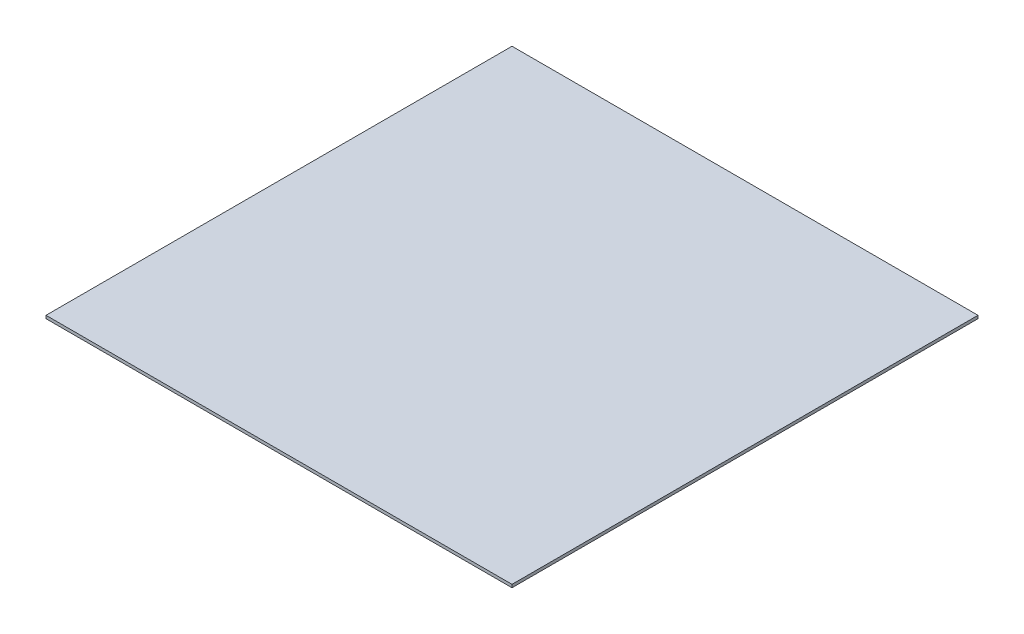
ISO-10303-21;
HEADER;
FILE_DESCRIPTION(('STEP AP214'),'2;1');
FILE_NAME('part.step','',(''),(''),'','','');
FILE_SCHEMA(('AUTOMOTIVE_DESIGN { 1 0 10303 214 1 1 1 1 }'));
ENDSEC;
DATA;
#1=APPLICATION_CONTEXT('core data for automotive mechanical design processes');
#2=APPLICATION_PROTOCOL_DEFINITION('international standard','automotive_design',2000,#1);
#3=PRODUCT_CONTEXT('',#1,'mechanical');
#4=PRODUCT('Part','Part','',(#3));
#5=PRODUCT_RELATED_PRODUCT_CATEGORY('part','',(#4));
#6=PRODUCT_DEFINITION_FORMATION('','',#4);
#7=PRODUCT_DEFINITION_CONTEXT('part definition',#1,'design');
#8=PRODUCT_DEFINITION('design','',#6,#7);
#9=PRODUCT_DEFINITION_SHAPE('','',#8);
#10=(LENGTH_UNIT() NAMED_UNIT(*) SI_UNIT(.MILLI.,.METRE.));
#11=(NAMED_UNIT(*) PLANE_ANGLE_UNIT() SI_UNIT($,.RADIAN.));
#12=(NAMED_UNIT(*) SI_UNIT($,.STERADIAN.) SOLID_ANGLE_UNIT());
#13=UNCERTAINTY_MEASURE_WITH_UNIT(LENGTH_MEASURE(1.E-05),#10,'distance_accuracy_value','');
#14=(GEOMETRIC_REPRESENTATION_CONTEXT(3) GLOBAL_UNCERTAINTY_ASSIGNED_CONTEXT((#13)) GLOBAL_UNIT_ASSIGNED_CONTEXT((#10,
#11,#12)) REPRESENTATION_CONTEXT('',''));
#15=CARTESIAN_POINT('',(0.,0.,0.));
#16=DIRECTION('',(0.,0.,1.));
#17=DIRECTION('',(1.,0.,0.));
#18=AXIS2_PLACEMENT_3D('',#15,#16,#17);
#19=CARTESIAN_POINT('',(1648.25252000613,3.,154.715737616016));
#20=DIRECTION('',(-1.,0.,0.));
#21=DIRECTION('',(0.,0.,1.));
#22=AXIS2_PLACEMENT_3D('',#19,#20,#21);
#23=PLANE('',#22);
#24=DIRECTION('',(0.,0.,-1.));
#25=VECTOR('',#24,1.);
#26=CARTESIAN_POINT('',(1648.25252000613,0.,154.715737616016));
#27=LINE('',#26,#25);
#28=CARTESIAN_POINT('',(1648.25252000613,0.,154.715737616016));
#29=VERTEX_POINT('',#28);
#30=CARTESIAN_POINT('',(1648.25252000613,0.,-315.184262383984));
#31=VERTEX_POINT('',#30);
#32=EDGE_CURVE('E96',#29,#31,#27,.T.);
#33=ORIENTED_EDGE('',*,*,#32,.T.);
#34=DIRECTION('',(0.,-1.,0.));
#35=VECTOR('',#34,1.);
#36=CARTESIAN_POINT('',(1648.25252000613,3.,-315.184262383984));
#37=LINE('',#36,#35);
#38=CARTESIAN_POINT('',(1648.25252000613,3.,-315.184262383984));
#39=VERTEX_POINT('',#38);
#40=EDGE_CURVE('E11',#39,#31,#37,.T.);
#41=ORIENTED_EDGE('',*,*,#40,.F.);
#42=DIRECTION('',(0.,0.,-1.));
#43=VECTOR('',#42,1.);
#44=CARTESIAN_POINT('',(1648.25252000613,3.,154.715737616016));
#45=LINE('',#44,#43);
#46=CARTESIAN_POINT('',(1648.25252000613,3.,154.715737616016));
#47=VERTEX_POINT('',#46);
#48=EDGE_CURVE('E84',#47,#39,#45,.T.);
#49=ORIENTED_EDGE('',*,*,#48,.F.);
#50=DIRECTION('',(0.,-1.,0.));
#51=VECTOR('',#50,1.);
#52=CARTESIAN_POINT('',(1648.25252000613,3.,154.715737616016));
#53=LINE('',#52,#51);
#54=EDGE_CURVE('E92',#47,#29,#53,.T.);
#55=ORIENTED_EDGE('',*,*,#54,.T.);
#56=EDGE_LOOP('',(#33,#41,#49,#55));
#57=FACE_BOUND('',#56,.T.);
#58=ADVANCED_FACE('F33',(#57),#23,.F.);
#59=CARTESIAN_POINT('',(1648.25252000613,3.,-315.184262383984));
#60=DIRECTION('',(0.,0.,1.));
#61=DIRECTION('',(1.,0.,0.));
#62=AXIS2_PLACEMENT_3D('',#59,#60,#61);
#63=PLANE('',#62);
#64=DIRECTION('',(-1.,0.,0.));
#65=VECTOR('',#64,1.);
#66=CARTESIAN_POINT('',(1648.25252000613,0.,-315.184262383984));
#67=LINE('',#66,#65);
#68=CARTESIAN_POINT('',(1178.35252000613,0.,-315.184262383984));
#69=VERTEX_POINT('',#68);
#70=EDGE_CURVE('E88',#31,#69,#67,.T.);
#71=ORIENTED_EDGE('',*,*,#70,.T.);
#72=DIRECTION('',(0.,-1.,0.));
#73=VECTOR('',#72,1.);
#74=CARTESIAN_POINT('',(1178.35252000613,3.,-315.184262383984));
#75=LINE('',#74,#73);
#76=CARTESIAN_POINT('',(1178.35252000613,3.,-315.184262383984));
#77=VERTEX_POINT('',#76);
#78=EDGE_CURVE('E41',#77,#69,#75,.T.);
#79=ORIENTED_EDGE('',*,*,#78,.F.);
#80=DIRECTION('',(-1.,0.,0.));
#81=VECTOR('',#80,1.);
#82=CARTESIAN_POINT('',(1648.25252000613,3.,-315.184262383984));
#83=LINE('',#82,#81);
#84=EDGE_CURVE('E79',#39,#77,#83,.T.);
#85=ORIENTED_EDGE('',*,*,#84,.F.);
#86=ORIENTED_EDGE('',*,*,#40,.T.);
#87=EDGE_LOOP('',(#71,#79,#85,#86));
#88=FACE_BOUND('',#87,.T.);
#89=ADVANCED_FACE('F87',(#88),#63,.F.);
#90=CARTESIAN_POINT('',(1178.35252000613,3.,154.715737616016));
#91=DIRECTION('',(1.,0.,0.));
#92=DIRECTION('',(0.,0.,-1.));
#93=AXIS2_PLACEMENT_3D('',#90,#91,#92);
#94=PLANE('',#93);
#95=DIRECTION('',(0.,0.,1.));
#96=VECTOR('',#95,1.);
#97=CARTESIAN_POINT('',(1178.35252000613,0.,154.715737616016));
#98=LINE('',#97,#96);
#99=CARTESIAN_POINT('',(1178.35252000613,0.,154.715737616016));
#100=VERTEX_POINT('',#99);
#101=EDGE_CURVE('E66',#69,#100,#98,.T.);
#102=ORIENTED_EDGE('',*,*,#101,.T.);
#103=DIRECTION('',(0.,-1.,0.));
#104=VECTOR('',#103,1.);
#105=CARTESIAN_POINT('',(1178.35252000613,3.,154.715737616016));
#106=LINE('',#105,#104);
#107=CARTESIAN_POINT('',(1178.35252000613,3.,154.715737616016));
#108=VERTEX_POINT('',#107);
#109=EDGE_CURVE('E89',#108,#100,#106,.T.);
#110=ORIENTED_EDGE('',*,*,#109,.F.);
#111=DIRECTION('',(0.,0.,1.));
#112=VECTOR('',#111,1.);
#113=CARTESIAN_POINT('',(1178.35252000613,3.,154.715737616016));
#114=LINE('',#113,#112);
#115=EDGE_CURVE('E82',#77,#108,#114,.T.);
#116=ORIENTED_EDGE('',*,*,#115,.F.);
#117=ORIENTED_EDGE('',*,*,#78,.T.);
#118=EDGE_LOOP('',(#102,#110,#116,#117));
#119=FACE_BOUND('',#118,.T.);
#120=ADVANCED_FACE('F90',(#119),#94,.F.);
#121=CARTESIAN_POINT('',(1648.25252000613,3.,154.715737616016));
#122=DIRECTION('',(0.,0.,-1.));
#123=DIRECTION('',(-1.,0.,0.));
#124=AXIS2_PLACEMENT_3D('',#121,#122,#123);
#125=PLANE('',#124);
#126=DIRECTION('',(1.,0.,0.));
#127=VECTOR('',#126,1.);
#128=CARTESIAN_POINT('',(1648.25252000613,0.,154.715737616016));
#129=LINE('',#128,#127);
#130=EDGE_CURVE('E72',#100,#29,#129,.T.);
#131=ORIENTED_EDGE('',*,*,#130,.T.);
#132=ORIENTED_EDGE('',*,*,#54,.F.);
#133=DIRECTION('',(1.,0.,0.));
#134=VECTOR('',#133,1.);
#135=CARTESIAN_POINT('',(1648.25252000613,3.,154.715737616016));
#136=LINE('',#135,#134);
#137=EDGE_CURVE('E49',#108,#47,#136,.T.);
#138=ORIENTED_EDGE('',*,*,#137,.F.);
#139=ORIENTED_EDGE('',*,*,#109,.T.);
#140=EDGE_LOOP('',(#131,#132,#138,#139));
#141=FACE_BOUND('',#140,.T.);
#142=ADVANCED_FACE('F103',(#141),#125,.F.);
#143=CARTESIAN_POINT('',(0.,3.,0.));
#144=DIRECTION('',(0.,1.,0.));
#145=DIRECTION('',(0.,0.,1.));
#146=AXIS2_PLACEMENT_3D('',#143,#144,#145);
#147=PLANE('',#146);
#148=ORIENTED_EDGE('',*,*,#48,.T.);
#149=ORIENTED_EDGE('',*,*,#84,.T.);
#150=ORIENTED_EDGE('',*,*,#115,.T.);
#151=ORIENTED_EDGE('',*,*,#137,.T.);
#152=EDGE_LOOP('',(#148,#149,#150,#151));
#153=FACE_BOUND('',#152,.T.);
#154=ADVANCED_FACE('F80',(#153),#147,.T.);
#155=CARTESIAN_POINT('',(0.,0.,0.));
#156=DIRECTION('',(0.,1.,0.));
#157=DIRECTION('',(0.,0.,1.));
#158=AXIS2_PLACEMENT_3D('',#155,#156,#157);
#159=PLANE('',#158);
#160=ORIENTED_EDGE('',*,*,#32,.F.);
#161=ORIENTED_EDGE('',*,*,#130,.F.);
#162=ORIENTED_EDGE('',*,*,#101,.F.);
#163=ORIENTED_EDGE('',*,*,#70,.F.);
#164=EDGE_LOOP('',(#160,#161,#162,#163));
#165=FACE_BOUND('',#164,.T.);
#166=ADVANCED_FACE('F106',(#165),#159,.F.);
#167=CLOSED_SHELL('',(#58,#89,#120,#142,#154,#166));
#168=MANIFOLD_SOLID_BREP('B2',#167);
#169=ADVANCED_BREP_SHAPE_REPRESENTATION('',(#18,#168),#14);
#170=SHAPE_DEFINITION_REPRESENTATION(#9,#169);
ENDSEC;
END-ISO-10303-21;
